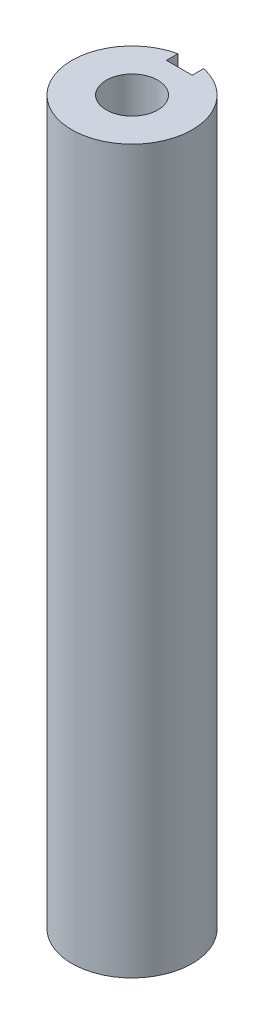
ISO-10303-21;
HEADER;
FILE_DESCRIPTION(('STEP AP214'),'2;1');
FILE_NAME('part.step','',(''),(''),'','','');
FILE_SCHEMA(('AUTOMOTIVE_DESIGN { 1 0 10303 214 1 1 1 1 }'));
ENDSEC;
DATA;
#1=APPLICATION_CONTEXT('core data for automotive mechanical design processes');
#2=APPLICATION_PROTOCOL_DEFINITION('international standard','automotive_design',2000,#1);
#3=PRODUCT_CONTEXT('',#1,'mechanical');
#4=PRODUCT('Part','Part','',(#3));
#5=PRODUCT_RELATED_PRODUCT_CATEGORY('part','',(#4));
#6=PRODUCT_DEFINITION_FORMATION('','',#4);
#7=PRODUCT_DEFINITION_CONTEXT('part definition',#1,'design');
#8=PRODUCT_DEFINITION('design','',#6,#7);
#9=PRODUCT_DEFINITION_SHAPE('','',#8);
#10=(LENGTH_UNIT() NAMED_UNIT(*) SI_UNIT(.MILLI.,.METRE.));
#11=(NAMED_UNIT(*) PLANE_ANGLE_UNIT() SI_UNIT($,.RADIAN.));
#12=(NAMED_UNIT(*) SI_UNIT($,.STERADIAN.) SOLID_ANGLE_UNIT());
#13=UNCERTAINTY_MEASURE_WITH_UNIT(LENGTH_MEASURE(1.E-05),#10,'distance_accuracy_value','');
#14=(GEOMETRIC_REPRESENTATION_CONTEXT(3) GLOBAL_UNCERTAINTY_ASSIGNED_CONTEXT((#13)) GLOBAL_UNIT_ASSIGNED_CONTEXT((#10,
#11,#12)) REPRESENTATION_CONTEXT('',''));
#15=CARTESIAN_POINT('',(0.,0.,0.));
#16=DIRECTION('',(0.,0.,1.));
#17=DIRECTION('',(1.,0.,0.));
#18=AXIS2_PLACEMENT_3D('',#15,#16,#17);
#19=CARTESIAN_POINT('',(0.,133.35,0.));
#20=DIRECTION('',(0.,-1.,0.));
#21=DIRECTION('',(0.,0.,-1.));
#22=AXIS2_PLACEMENT_3D('',#19,#20,#21);
#23=PLANE('',#22);
#24=CARTESIAN_POINT('',(0.,133.35,0.));
#25=DIRECTION('',(0.,1.,0.));
#26=DIRECTION('',(0.,0.,-1.));
#27=AXIS2_PLACEMENT_3D('',#24,#25,#26);
#28=CIRCLE('',#27,11.1125);
#29=CARTESIAN_POINT('',(-2.38125,133.35,-10.854368000372));
#30=VERTEX_POINT('',#29);
#31=CARTESIAN_POINT('',(2.38125,133.35,-10.854368000372));
#32=VERTEX_POINT('',#31);
#33=EDGE_CURVE('E108',#30,#32,#28,.T.);
#34=ORIENTED_EDGE('',*,*,#33,.T.);
#35=DIRECTION('',(0.,0.,1.));
#36=VECTOR('',#35,1.);
#37=CARTESIAN_POINT('',(2.38125,133.35,-10.854368000372));
#38=LINE('',#37,#36);
#39=CARTESIAN_POINT('',(2.38125,133.35,-8.73125));
#40=VERTEX_POINT('',#39);
#41=EDGE_CURVE('E103',#32,#40,#38,.T.);
#42=ORIENTED_EDGE('',*,*,#41,.T.);
#43=DIRECTION('',(-1.,0.,0.));
#44=VECTOR('',#43,1.);
#45=CARTESIAN_POINT('',(-2.38125,133.35,-8.73125));
#46=LINE('',#45,#44);
#47=CARTESIAN_POINT('',(-2.38125,133.35,-8.73125));
#48=VERTEX_POINT('',#47);
#49=EDGE_CURVE('E106',#40,#48,#46,.T.);
#50=ORIENTED_EDGE('',*,*,#49,.T.);
#51=DIRECTION('',(0.,0.,-1.));
#52=VECTOR('',#51,1.);
#53=CARTESIAN_POINT('',(-2.38125,133.35,-10.854368000372));
#54=LINE('',#53,#52);
#55=EDGE_CURVE('E73',#48,#30,#54,.T.);
#56=ORIENTED_EDGE('',*,*,#55,.T.);
#57=EDGE_LOOP('',(#34,#42,#50,#56));
#58=FACE_BOUND('',#57,.T.);
#59=CARTESIAN_POINT('',(0.,133.35,0.));
#60=DIRECTION('',(0.,1.,0.));
#61=DIRECTION('',(0.,0.,1.));
#62=AXIS2_PLACEMENT_3D('',#59,#60,#61);
#63=CIRCLE('',#62,4.7625);
#64=CARTESIAN_POINT('',(0.,133.35,4.7625));
#65=VERTEX_POINT('',#64);
#66=EDGE_CURVE('E129',#65,#65,#63,.T.);
#67=ORIENTED_EDGE('',*,*,#66,.F.);
#68=EDGE_LOOP('',(#67));
#69=FACE_BOUND('',#68,.T.);
#70=ADVANCED_FACE('F55',(#58,#69),#23,.F.);
#71=CARTESIAN_POINT('',(0.,0.,0.));
#72=DIRECTION('',(0.,-1.,0.));
#73=DIRECTION('',(0.,0.,-1.));
#74=AXIS2_PLACEMENT_3D('',#71,#72,#73);
#75=PLANE('',#74);
#76=CARTESIAN_POINT('',(0.,0.,0.));
#77=DIRECTION('',(0.,1.,0.));
#78=DIRECTION('',(0.,0.,-1.));
#79=AXIS2_PLACEMENT_3D('',#76,#77,#78);
#80=CIRCLE('',#79,11.1125);
#81=CARTESIAN_POINT('',(-2.38125,0.,-10.854368000372));
#82=VERTEX_POINT('',#81);
#83=CARTESIAN_POINT('',(2.38125,0.,-10.854368000372));
#84=VERTEX_POINT('',#83);
#85=EDGE_CURVE('E125',#82,#84,#80,.T.);
#86=ORIENTED_EDGE('',*,*,#85,.F.);
#87=DIRECTION('',(0.,0.,-1.));
#88=VECTOR('',#87,1.);
#89=CARTESIAN_POINT('',(-2.38125,0.,-10.854368000372));
#90=LINE('',#89,#88);
#91=CARTESIAN_POINT('',(-2.38125,0.,-8.73125));
#92=VERTEX_POINT('',#91);
#93=EDGE_CURVE('E96',#92,#82,#90,.T.);
#94=ORIENTED_EDGE('',*,*,#93,.F.);
#95=DIRECTION('',(-1.,0.,0.));
#96=VECTOR('',#95,1.);
#97=CARTESIAN_POINT('',(-2.38125,0.,-8.73125));
#98=LINE('',#97,#96);
#99=CARTESIAN_POINT('',(2.38125,0.,-8.73125));
#100=VERTEX_POINT('',#99);
#101=EDGE_CURVE('E90',#100,#92,#98,.T.);
#102=ORIENTED_EDGE('',*,*,#101,.F.);
#103=DIRECTION('',(0.,0.,1.));
#104=VECTOR('',#103,1.);
#105=CARTESIAN_POINT('',(2.38125,0.,-10.854368000372));
#106=LINE('',#105,#104);
#107=EDGE_CURVE('E113',#84,#100,#106,.T.);
#108=ORIENTED_EDGE('',*,*,#107,.F.);
#109=EDGE_LOOP('',(#86,#94,#102,#108));
#110=FACE_BOUND('',#109,.T.);
#111=CARTESIAN_POINT('',(0.,0.,0.));
#112=DIRECTION('',(0.,1.,0.));
#113=DIRECTION('',(0.,0.,1.));
#114=AXIS2_PLACEMENT_3D('',#111,#112,#113);
#115=CIRCLE('',#114,4.7625);
#116=CARTESIAN_POINT('',(0.,0.,4.7625));
#117=VERTEX_POINT('',#116);
#118=EDGE_CURVE('E149',#117,#117,#115,.T.);
#119=ORIENTED_EDGE('',*,*,#118,.T.);
#120=EDGE_LOOP('',(#119));
#121=FACE_BOUND('',#120,.T.);
#122=ADVANCED_FACE('F143',(#110,#121),#75,.T.);
#123=CARTESIAN_POINT('',(0.,133.35,0.));
#124=DIRECTION('',(0.,-1.,0.));
#125=DIRECTION('',(0.,0.,-1.));
#126=AXIS2_PLACEMENT_3D('',#123,#124,#125);
#127=CYLINDRICAL_SURFACE('',#126,11.1125);
#128=ORIENTED_EDGE('',*,*,#85,.T.);
#129=DIRECTION('',(0.,-1.,0.));
#130=VECTOR('',#129,1.);
#131=CARTESIAN_POINT('',(2.38125,133.35,-10.854368000372));
#132=LINE('',#131,#130);
#133=EDGE_CURVE('E13',#32,#84,#132,.T.);
#134=ORIENTED_EDGE('',*,*,#133,.F.);
#135=ORIENTED_EDGE('',*,*,#33,.F.);
#136=DIRECTION('',(0.,-1.,0.));
#137=VECTOR('',#136,1.);
#138=CARTESIAN_POINT('',(-2.38125,133.35,-10.854368000372));
#139=LINE('',#138,#137);
#140=EDGE_CURVE('E121',#30,#82,#139,.T.);
#141=ORIENTED_EDGE('',*,*,#140,.T.);
#142=EDGE_LOOP('',(#128,#134,#135,#141));
#143=FACE_BOUND('',#142,.T.);
#144=ADVANCED_FACE('F57',(#143),#127,.T.);
#145=CARTESIAN_POINT('',(2.38125,133.35,-10.854368000372));
#146=DIRECTION('',(1.,0.,0.));
#147=DIRECTION('',(0.,0.,-1.));
#148=AXIS2_PLACEMENT_3D('',#145,#146,#147);
#149=PLANE('',#148);
#150=ORIENTED_EDGE('',*,*,#107,.T.);
#151=DIRECTION('',(0.,-1.,0.));
#152=VECTOR('',#151,1.);
#153=CARTESIAN_POINT('',(2.38125,133.35,-8.73125));
#154=LINE('',#153,#152);
#155=EDGE_CURVE('E65',#40,#100,#154,.T.);
#156=ORIENTED_EDGE('',*,*,#155,.F.);
#157=ORIENTED_EDGE('',*,*,#41,.F.);
#158=ORIENTED_EDGE('',*,*,#133,.T.);
#159=EDGE_LOOP('',(#150,#156,#157,#158));
#160=FACE_BOUND('',#159,.T.);
#161=ADVANCED_FACE('F112',(#160),#149,.F.);
#162=CARTESIAN_POINT('',(-2.38125,133.35,-8.73125));
#163=DIRECTION('',(0.,0.,1.));
#164=DIRECTION('',(1.,0.,0.));
#165=AXIS2_PLACEMENT_3D('',#162,#163,#164);
#166=PLANE('',#165);
#167=ORIENTED_EDGE('',*,*,#101,.T.);
#168=DIRECTION('',(0.,-1.,0.));
#169=VECTOR('',#168,1.);
#170=CARTESIAN_POINT('',(-2.38125,133.35,-8.73125));
#171=LINE('',#170,#169);
#172=EDGE_CURVE('E115',#48,#92,#171,.T.);
#173=ORIENTED_EDGE('',*,*,#172,.F.);
#174=ORIENTED_EDGE('',*,*,#49,.F.);
#175=ORIENTED_EDGE('',*,*,#155,.T.);
#176=EDGE_LOOP('',(#167,#173,#174,#175));
#177=FACE_BOUND('',#176,.T.);
#178=ADVANCED_FACE('F116',(#177),#166,.F.);
#179=CARTESIAN_POINT('',(-2.38125,133.35,-10.854368000372));
#180=DIRECTION('',(-1.,0.,0.));
#181=DIRECTION('',(0.,0.,1.));
#182=AXIS2_PLACEMENT_3D('',#179,#180,#181);
#183=PLANE('',#182);
#184=ORIENTED_EDGE('',*,*,#93,.T.);
#185=ORIENTED_EDGE('',*,*,#140,.F.);
#186=ORIENTED_EDGE('',*,*,#55,.F.);
#187=ORIENTED_EDGE('',*,*,#172,.T.);
#188=EDGE_LOOP('',(#184,#185,#186,#187));
#189=FACE_BOUND('',#188,.T.);
#190=ADVANCED_FACE('F140',(#189),#183,.F.);
#191=CARTESIAN_POINT('',(0.,133.35,0.));
#192=DIRECTION('',(0.,-1.,0.));
#193=DIRECTION('',(0.,0.,-1.));
#194=AXIS2_PLACEMENT_3D('',#191,#192,#193);
#195=CYLINDRICAL_SURFACE('',#194,4.7625);
#196=ORIENTED_EDGE('',*,*,#66,.T.);
#197=EDGE_LOOP('',(#196));
#198=FACE_BOUND('',#197,.T.);
#199=ORIENTED_EDGE('',*,*,#118,.F.);
#200=EDGE_LOOP('',(#199));
#201=FACE_BOUND('',#200,.T.);
#202=ADVANCED_FACE('F158',(#198,#201),#195,.F.);
#203=CLOSED_SHELL('',(#70,#122,#144,#161,#178,#190,#202));
#204=MANIFOLD_SOLID_BREP('B2',#203);
#205=ADVANCED_BREP_SHAPE_REPRESENTATION('',(#18,#204),#14);
#206=SHAPE_DEFINITION_REPRESENTATION(#9,#205);
ENDSEC;
END-ISO-10303-21;
